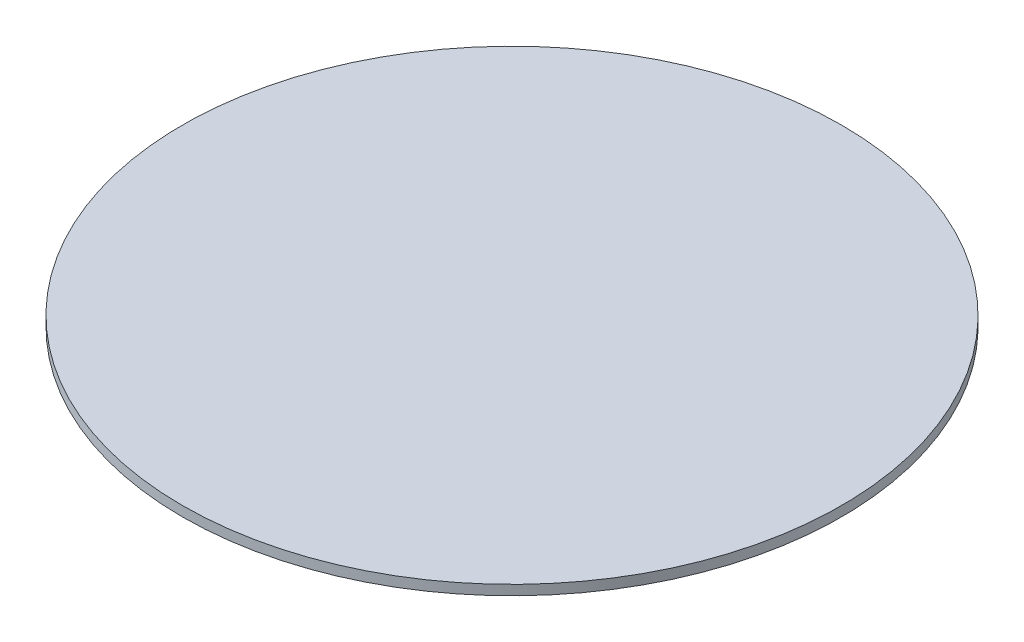
ISO-10303-21;
HEADER;
FILE_DESCRIPTION(('STEP AP214'),'2;1');
FILE_NAME('part.step','',(''),(''),'','','');
FILE_SCHEMA(('AUTOMOTIVE_DESIGN { 1 0 10303 214 1 1 1 1 }'));
ENDSEC;
DATA;
#1=APPLICATION_CONTEXT('core data for automotive mechanical design processes');
#2=APPLICATION_PROTOCOL_DEFINITION('international standard','automotive_design',2000,#1);
#3=PRODUCT_CONTEXT('',#1,'mechanical');
#4=PRODUCT('Part','Part','',(#3));
#5=PRODUCT_RELATED_PRODUCT_CATEGORY('part','',(#4));
#6=PRODUCT_DEFINITION_FORMATION('','',#4);
#7=PRODUCT_DEFINITION_CONTEXT('part definition',#1,'design');
#8=PRODUCT_DEFINITION('design','',#6,#7);
#9=PRODUCT_DEFINITION_SHAPE('','',#8);
#10=(LENGTH_UNIT() NAMED_UNIT(*) SI_UNIT(.MILLI.,.METRE.));
#11=(NAMED_UNIT(*) PLANE_ANGLE_UNIT() SI_UNIT($,.RADIAN.));
#12=(NAMED_UNIT(*) SI_UNIT($,.STERADIAN.) SOLID_ANGLE_UNIT());
#13=UNCERTAINTY_MEASURE_WITH_UNIT(LENGTH_MEASURE(1.E-05),#10,'distance_accuracy_value','');
#14=(GEOMETRIC_REPRESENTATION_CONTEXT(3) GLOBAL_UNCERTAINTY_ASSIGNED_CONTEXT((#13)) GLOBAL_UNIT_ASSIGNED_CONTEXT((#10,
#11,#12)) REPRESENTATION_CONTEXT('',''));
#15=CARTESIAN_POINT('',(0.,0.,0.));
#16=DIRECTION('',(0.,0.,1.));
#17=DIRECTION('',(1.,0.,0.));
#18=AXIS2_PLACEMENT_3D('',#15,#16,#17);
#19=CARTESIAN_POINT('',(0.,1.5,0.));
#20=DIRECTION('',(0.,-1.,0.));
#21=DIRECTION('',(0.,0.,-1.));
#22=AXIS2_PLACEMENT_3D('',#19,#20,#21);
#23=CYLINDRICAL_SURFACE('',#22,50.);
#24=CARTESIAN_POINT('',(0.,1.5,0.));
#25=DIRECTION('',(0.,1.,0.));
#26=DIRECTION('',(0.,0.,1.));
#27=AXIS2_PLACEMENT_3D('',#24,#25,#26);
#28=CIRCLE('',#27,50.);
#29=CARTESIAN_POINT('',(0.,1.5,50.));
#30=VERTEX_POINT('',#29);
#31=EDGE_CURVE('E10',#30,#30,#28,.T.);
#32=ORIENTED_EDGE('',*,*,#31,.F.);
#33=EDGE_LOOP('',(#32));
#34=FACE_BOUND('',#33,.T.);
#35=CARTESIAN_POINT('',(0.,0.,0.));
#36=DIRECTION('',(0.,1.,0.));
#37=DIRECTION('',(0.,0.,1.));
#38=AXIS2_PLACEMENT_3D('',#35,#36,#37);
#39=CIRCLE('',#38,50.);
#40=CARTESIAN_POINT('',(0.,0.,50.));
#41=VERTEX_POINT('',#40);
#42=EDGE_CURVE('E34',#41,#41,#39,.T.);
#43=ORIENTED_EDGE('',*,*,#42,.T.);
#44=EDGE_LOOP('',(#43));
#45=FACE_BOUND('',#44,.T.);
#46=ADVANCED_FACE('F31',(#34,#45),#23,.T.);
#47=CARTESIAN_POINT('',(0.,1.5,0.));
#48=DIRECTION('',(0.,1.,0.));
#49=DIRECTION('',(0.,0.,1.));
#50=AXIS2_PLACEMENT_3D('',#47,#48,#49);
#51=PLANE('',#50);
#52=ORIENTED_EDGE('',*,*,#31,.T.);
#53=EDGE_LOOP('',(#52));
#54=FACE_BOUND('',#53,.T.);
#55=ADVANCED_FACE('F46',(#54),#51,.T.);
#56=CARTESIAN_POINT('',(0.,0.,0.));
#57=DIRECTION('',(0.,1.,0.));
#58=DIRECTION('',(0.,0.,1.));
#59=AXIS2_PLACEMENT_3D('',#56,#57,#58);
#60=PLANE('',#59);
#61=ORIENTED_EDGE('',*,*,#42,.F.);
#62=EDGE_LOOP('',(#61));
#63=FACE_BOUND('',#62,.T.);
#64=ADVANCED_FACE('F44',(#63),#60,.F.);
#65=CLOSED_SHELL('',(#46,#55,#64));
#66=MANIFOLD_SOLID_BREP('B2',#65);
#67=ADVANCED_BREP_SHAPE_REPRESENTATION('',(#18,#66),#14);
#68=SHAPE_DEFINITION_REPRESENTATION(#9,#67);
ENDSEC;
END-ISO-10303-21;
